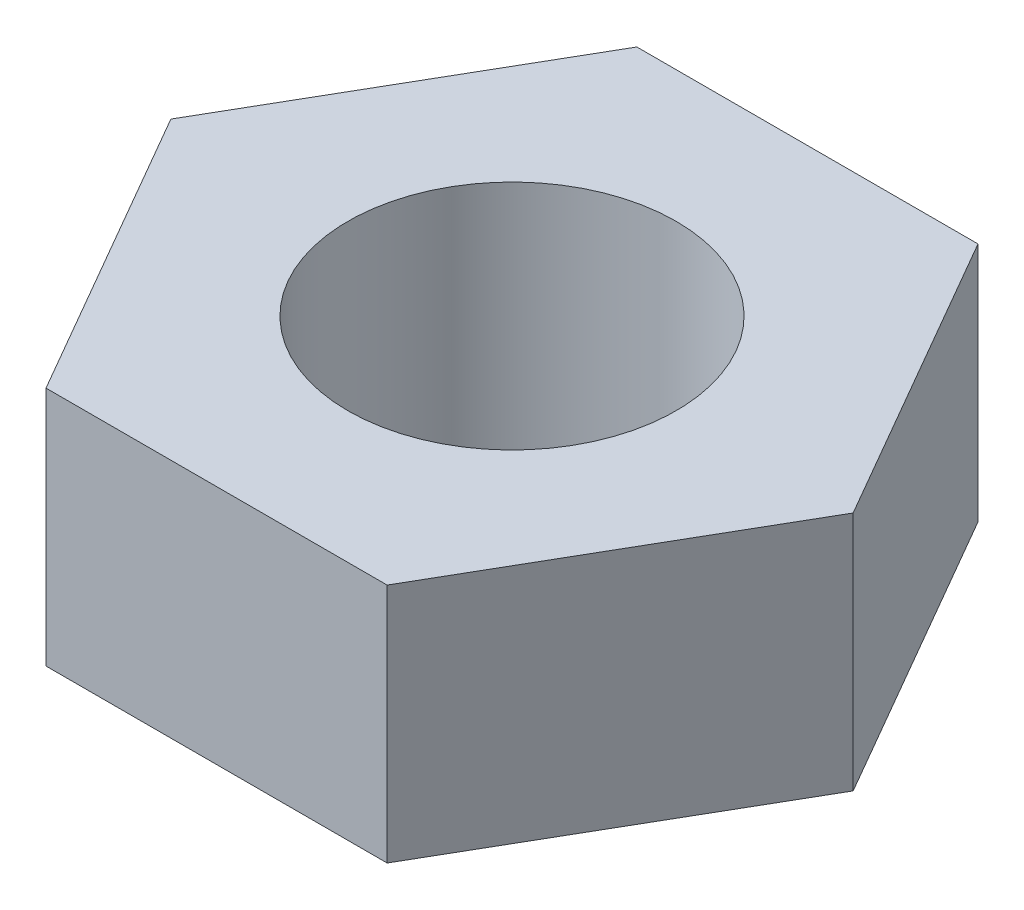
ISO-10303-21;
HEADER;
FILE_DESCRIPTION(('STEP AP214'),'2;1');
FILE_NAME('part.step','',(''),(''),'','','');
FILE_SCHEMA(('AUTOMOTIVE_DESIGN { 1 0 10303 214 1 1 1 1 }'));
ENDSEC;
DATA;
#1=APPLICATION_CONTEXT('core data for automotive mechanical design processes');
#2=APPLICATION_PROTOCOL_DEFINITION('international standard','automotive_design',2000,#1);
#3=PRODUCT_CONTEXT('',#1,'mechanical');
#4=PRODUCT('Part','Part','',(#3));
#5=PRODUCT_RELATED_PRODUCT_CATEGORY('part','',(#4));
#6=PRODUCT_DEFINITION_FORMATION('','',#4);
#7=PRODUCT_DEFINITION_CONTEXT('part definition',#1,'design');
#8=PRODUCT_DEFINITION('design','',#6,#7);
#9=PRODUCT_DEFINITION_SHAPE('','',#8);
#10=(LENGTH_UNIT() NAMED_UNIT(*) SI_UNIT(.MILLI.,.METRE.));
#11=(NAMED_UNIT(*) PLANE_ANGLE_UNIT() SI_UNIT($,.RADIAN.));
#12=(NAMED_UNIT(*) SI_UNIT($,.STERADIAN.) SOLID_ANGLE_UNIT());
#13=UNCERTAINTY_MEASURE_WITH_UNIT(LENGTH_MEASURE(1.E-05),#10,'distance_accuracy_value','');
#14=(GEOMETRIC_REPRESENTATION_CONTEXT(3) GLOBAL_UNCERTAINTY_ASSIGNED_CONTEXT((#13)) GLOBAL_UNIT_ASSIGNED_CONTEXT((#10,
#11,#12)) REPRESENTATION_CONTEXT('',''));
#15=CARTESIAN_POINT('',(0.,0.,0.));
#16=DIRECTION('',(0.,0.,1.));
#17=DIRECTION('',(1.,0.,0.));
#18=AXIS2_PLACEMENT_3D('',#15,#16,#17);
#19=CARTESIAN_POINT('',(0.,2.2,0.));
#20=DIRECTION('',(0.,1.,0.));
#21=DIRECTION('',(0.,0.,1.));
#22=AXIS2_PLACEMENT_3D('',#19,#20,#21);
#23=PLANE('',#22);
#24=DIRECTION('',(0.499999999999995,0.,-0.866025403784442));
#25=VECTOR('',#24,1.);
#26=CARTESIAN_POINT('',(1.55884572681202,2.2,2.69999999999998));
#27=LINE('',#26,#25);
#28=CARTESIAN_POINT('',(1.55884572681202,2.2,2.69999999999998));
#29=VERTEX_POINT('',#28);
#30=CARTESIAN_POINT('',(3.11769145362398,2.2,0.));
#31=VERTEX_POINT('',#30);
#32=EDGE_CURVE('E129',#29,#31,#27,.T.);
#33=ORIENTED_EDGE('',*,*,#32,.T.);
#34=DIRECTION('',(-0.500000000000001,0.,-0.866025403784438));
#35=VECTOR('',#34,1.);
#36=CARTESIAN_POINT('',(3.11769145362398,2.2,0.));
#37=LINE('',#36,#35);
#38=CARTESIAN_POINT('',(1.55884572681198,2.2,-2.70000000000001));
#39=VERTEX_POINT('',#38);
#40=EDGE_CURVE('E87',#31,#39,#37,.T.);
#41=ORIENTED_EDGE('',*,*,#40,.T.);
#42=DIRECTION('',(-1.,0.,0.));
#43=VECTOR('',#42,1.);
#44=CARTESIAN_POINT('',(1.55884572681198,2.2,-2.70000000000001));
#45=LINE('',#44,#43);
#46=CARTESIAN_POINT('',(-1.558845726812,2.2,-2.69999999999999));
#47=VERTEX_POINT('',#46);
#48=EDGE_CURVE('E100',#39,#47,#45,.T.);
#49=ORIENTED_EDGE('',*,*,#48,.T.);
#50=DIRECTION('',(-0.499999999999995,0.,0.866025403784441));
#51=VECTOR('',#50,1.);
#52=CARTESIAN_POINT('',(-1.558845726812,2.2,-2.69999999999999));
#53=LINE('',#52,#51);
#54=CARTESIAN_POINT('',(-3.11769145362398,2.2,0.));
#55=VERTEX_POINT('',#54);
#56=EDGE_CURVE('E94',#47,#55,#53,.T.);
#57=ORIENTED_EDGE('',*,*,#56,.T.);
#58=DIRECTION('',(0.500000000000007,0.,0.866025403784435));
#59=VECTOR('',#58,1.);
#60=CARTESIAN_POINT('',(-3.11769145362398,2.2,0.));
#61=LINE('',#60,#59);
#62=CARTESIAN_POINT('',(-1.55884572681197,2.2,2.70000000000002));
#63=VERTEX_POINT('',#62);
#64=EDGE_CURVE('E98',#55,#63,#61,.T.);
#65=ORIENTED_EDGE('',*,*,#64,.T.);
#66=DIRECTION('',(1.,0.,0.));
#67=VECTOR('',#66,1.);
#68=CARTESIAN_POINT('',(-1.55884572681197,2.2,2.70000000000002));
#69=LINE('',#68,#67);
#70=EDGE_CURVE('E50',#63,#29,#69,.T.);
#71=ORIENTED_EDGE('',*,*,#70,.T.);
#72=EDGE_LOOP('',(#33,#41,#49,#57,#65,#71));
#73=FACE_BOUND('',#72,.T.);
#74=CARTESIAN_POINT('',(0.,2.2,0.));
#75=DIRECTION('',(0.,1.,0.));
#76=DIRECTION('',(0.,0.,1.));
#77=AXIS2_PLACEMENT_3D('',#74,#75,#76);
#78=CIRCLE('',#77,1.5);
#79=CARTESIAN_POINT('',(0.,2.2,1.5));
#80=VERTEX_POINT('',#79);
#81=EDGE_CURVE('E122',#80,#80,#78,.T.);
#82=ORIENTED_EDGE('',*,*,#81,.F.);
#83=EDGE_LOOP('',(#82));
#84=FACE_BOUND('',#83,.T.);
#85=ADVANCED_FACE('F33',(#73,#84),#23,.T.);
#86=CARTESIAN_POINT('',(0.,0.,0.));
#87=DIRECTION('',(0.,1.,0.));
#88=DIRECTION('',(0.,0.,1.));
#89=AXIS2_PLACEMENT_3D('',#86,#87,#88);
#90=PLANE('',#89);
#91=DIRECTION('',(0.499999999999995,0.,-0.866025403784442));
#92=VECTOR('',#91,1.);
#93=CARTESIAN_POINT('',(1.55884572681202,0.,2.69999999999998));
#94=LINE('',#93,#92);
#95=CARTESIAN_POINT('',(1.55884572681202,0.,2.69999999999998));
#96=VERTEX_POINT('',#95);
#97=CARTESIAN_POINT('',(3.11769145362398,0.,0.));
#98=VERTEX_POINT('',#97);
#99=EDGE_CURVE('E118',#96,#98,#94,.T.);
#100=ORIENTED_EDGE('',*,*,#99,.F.);
#101=DIRECTION('',(1.,0.,0.));
#102=VECTOR('',#101,1.);
#103=CARTESIAN_POINT('',(-1.55884572681197,0.,2.70000000000002));
#104=LINE('',#103,#102);
#105=CARTESIAN_POINT('',(-1.55884572681197,0.,2.70000000000002));
#106=VERTEX_POINT('',#105);
#107=EDGE_CURVE('E79',#106,#96,#104,.T.);
#108=ORIENTED_EDGE('',*,*,#107,.F.);
#109=DIRECTION('',(0.500000000000007,0.,0.866025403784435));
#110=VECTOR('',#109,1.);
#111=CARTESIAN_POINT('',(-3.11769145362398,0.,0.));
#112=LINE('',#111,#110);
#113=CARTESIAN_POINT('',(-3.11769145362398,0.,0.));
#114=VERTEX_POINT('',#113);
#115=EDGE_CURVE('E73',#114,#106,#112,.T.);
#116=ORIENTED_EDGE('',*,*,#115,.F.);
#117=DIRECTION('',(-0.499999999999995,0.,0.866025403784441));
#118=VECTOR('',#117,1.);
#119=CARTESIAN_POINT('',(-1.558845726812,0.,-2.69999999999999));
#120=LINE('',#119,#118);
#121=CARTESIAN_POINT('',(-1.558845726812,0.,-2.69999999999999));
#122=VERTEX_POINT('',#121);
#123=EDGE_CURVE('E108',#122,#114,#120,.T.);
#124=ORIENTED_EDGE('',*,*,#123,.F.);
#125=DIRECTION('',(-1.,0.,0.));
#126=VECTOR('',#125,1.);
#127=CARTESIAN_POINT('',(1.55884572681198,0.,-2.70000000000001));
#128=LINE('',#127,#126);
#129=CARTESIAN_POINT('',(1.55884572681198,0.,-2.70000000000001));
#130=VERTEX_POINT('',#129);
#131=EDGE_CURVE('E124',#130,#122,#128,.T.);
#132=ORIENTED_EDGE('',*,*,#131,.F.);
#133=DIRECTION('',(-0.500000000000001,0.,-0.866025403784438));
#134=VECTOR('',#133,1.);
#135=CARTESIAN_POINT('',(3.11769145362398,0.,0.));
#136=LINE('',#135,#134);
#137=EDGE_CURVE('E121',#98,#130,#136,.T.);
#138=ORIENTED_EDGE('',*,*,#137,.F.);
#139=EDGE_LOOP('',(#100,#108,#116,#124,#132,#138));
#140=FACE_BOUND('',#139,.T.);
#141=CARTESIAN_POINT('',(0.,0.,0.));
#142=DIRECTION('',(0.,1.,0.));
#143=DIRECTION('',(0.,0.,1.));
#144=AXIS2_PLACEMENT_3D('',#141,#142,#143);
#145=CIRCLE('',#144,1.5);
#146=CARTESIAN_POINT('',(0.,0.,1.5));
#147=VERTEX_POINT('',#146);
#148=EDGE_CURVE('E222',#147,#147,#145,.T.);
#149=ORIENTED_EDGE('',*,*,#148,.T.);
#150=EDGE_LOOP('',(#149));
#151=FACE_BOUND('',#150,.T.);
#152=ADVANCED_FACE('F138',(#140,#151),#90,.F.);
#153=CARTESIAN_POINT('',(1.55884572681202,2.2,2.69999999999998));
#154=DIRECTION('',(-0.866025403784442,0.,-0.499999999999995));
#155=DIRECTION('',(-0.499999999999995,0.,0.866025403784442));
#156=AXIS2_PLACEMENT_3D('',#153,#154,#155);
#157=PLANE('',#156);
#158=ORIENTED_EDGE('',*,*,#99,.T.);
#159=DIRECTION('',(0.,-1.,0.));
#160=VECTOR('',#159,1.);
#161=CARTESIAN_POINT('',(3.11769145362398,2.2,0.));
#162=LINE('',#161,#160);
#163=EDGE_CURVE('E11',#31,#98,#162,.T.);
#164=ORIENTED_EDGE('',*,*,#163,.F.);
#165=ORIENTED_EDGE('',*,*,#32,.F.);
#166=DIRECTION('',(0.,-1.,0.));
#167=VECTOR('',#166,1.);
#168=CARTESIAN_POINT('',(1.55884572681202,2.2,2.69999999999998));
#169=LINE('',#168,#167);
#170=EDGE_CURVE('E114',#29,#96,#169,.T.);
#171=ORIENTED_EDGE('',*,*,#170,.T.);
#172=EDGE_LOOP('',(#158,#164,#165,#171));
#173=FACE_BOUND('',#172,.T.);
#174=ADVANCED_FACE('F35',(#173),#157,.F.);
#175=CARTESIAN_POINT('',(3.11769145362398,2.2,0.));
#176=DIRECTION('',(-0.866025403784438,0.,0.500000000000001));
#177=DIRECTION('',(0.500000000000001,0.,0.866025403784438));
#178=AXIS2_PLACEMENT_3D('',#175,#176,#177);
#179=PLANE('',#178);
#180=ORIENTED_EDGE('',*,*,#137,.T.);
#181=DIRECTION('',(0.,-1.,0.));
#182=VECTOR('',#181,1.);
#183=CARTESIAN_POINT('',(1.55884572681198,2.2,-2.70000000000001));
#184=LINE('',#183,#182);
#185=EDGE_CURVE('E42',#39,#130,#184,.T.);
#186=ORIENTED_EDGE('',*,*,#185,.F.);
#187=ORIENTED_EDGE('',*,*,#40,.F.);
#188=ORIENTED_EDGE('',*,*,#163,.T.);
#189=EDGE_LOOP('',(#180,#186,#187,#188));
#190=FACE_BOUND('',#189,.T.);
#191=ADVANCED_FACE('F163',(#190),#179,.F.);
#192=CARTESIAN_POINT('',(1.55884572681198,2.2,-2.70000000000001));
#193=DIRECTION('',(0.,0.,1.));
#194=DIRECTION('',(1.,0.,0.));
#195=AXIS2_PLACEMENT_3D('',#192,#193,#194);
#196=PLANE('',#195);
#197=ORIENTED_EDGE('',*,*,#131,.T.);
#198=DIRECTION('',(0.,-1.,0.));
#199=VECTOR('',#198,1.);
#200=CARTESIAN_POINT('',(-1.558845726812,2.2,-2.69999999999999));
#201=LINE('',#200,#199);
#202=EDGE_CURVE('E109',#47,#122,#201,.T.);
#203=ORIENTED_EDGE('',*,*,#202,.F.);
#204=ORIENTED_EDGE('',*,*,#48,.F.);
#205=ORIENTED_EDGE('',*,*,#185,.T.);
#206=EDGE_LOOP('',(#197,#203,#204,#205));
#207=FACE_BOUND('',#206,.T.);
#208=ADVANCED_FACE('F135',(#207),#196,.F.);
#209=CARTESIAN_POINT('',(-1.558845726812,2.2,-2.69999999999999));
#210=DIRECTION('',(0.866025403784441,0.,0.499999999999995));
#211=DIRECTION('',(0.499999999999995,0.,-0.866025403784441));
#212=AXIS2_PLACEMENT_3D('',#209,#210,#211);
#213=PLANE('',#212);
#214=ORIENTED_EDGE('',*,*,#123,.T.);
#215=DIRECTION('',(0.,-1.,0.));
#216=VECTOR('',#215,1.);
#217=CARTESIAN_POINT('',(-3.11769145362398,2.2,0.));
#218=LINE('',#217,#216);
#219=EDGE_CURVE('E105',#55,#114,#218,.T.);
#220=ORIENTED_EDGE('',*,*,#219,.F.);
#221=ORIENTED_EDGE('',*,*,#56,.F.);
#222=ORIENTED_EDGE('',*,*,#202,.T.);
#223=EDGE_LOOP('',(#214,#220,#221,#222));
#224=FACE_BOUND('',#223,.T.);
#225=ADVANCED_FACE('F106',(#224),#213,.F.);
#226=CARTESIAN_POINT('',(-3.11769145362398,2.2,0.));
#227=DIRECTION('',(0.866025403784435,0.,-0.500000000000007));
#228=DIRECTION('',(-0.500000000000007,0.,-0.866025403784435));
#229=AXIS2_PLACEMENT_3D('',#226,#227,#228);
#230=PLANE('',#229);
#231=ORIENTED_EDGE('',*,*,#115,.T.);
#232=DIRECTION('',(0.,-1.,0.));
#233=VECTOR('',#232,1.);
#234=CARTESIAN_POINT('',(-1.55884572681197,2.2,2.70000000000002));
#235=LINE('',#234,#233);
#236=EDGE_CURVE('E110',#63,#106,#235,.T.);
#237=ORIENTED_EDGE('',*,*,#236,.F.);
#238=ORIENTED_EDGE('',*,*,#64,.F.);
#239=ORIENTED_EDGE('',*,*,#219,.T.);
#240=EDGE_LOOP('',(#231,#237,#238,#239));
#241=FACE_BOUND('',#240,.T.);
#242=ADVANCED_FACE('F112',(#241),#230,.F.);
#243=CARTESIAN_POINT('',(-1.55884572681197,2.2,2.70000000000002));
#244=DIRECTION('',(0.,0.,-1.));
#245=DIRECTION('',(-1.,0.,0.));
#246=AXIS2_PLACEMENT_3D('',#243,#244,#245);
#247=PLANE('',#246);
#248=ORIENTED_EDGE('',*,*,#107,.T.);
#249=ORIENTED_EDGE('',*,*,#170,.F.);
#250=ORIENTED_EDGE('',*,*,#70,.F.);
#251=ORIENTED_EDGE('',*,*,#236,.T.);
#252=EDGE_LOOP('',(#248,#249,#250,#251));
#253=FACE_BOUND('',#252,.T.);
#254=ADVANCED_FACE('F143',(#253),#247,.F.);
#255=CARTESIAN_POINT('',(0.,2.2,0.));
#256=DIRECTION('',(0.,-1.,0.));
#257=DIRECTION('',(0.,0.,-1.));
#258=AXIS2_PLACEMENT_3D('',#255,#256,#257);
#259=CYLINDRICAL_SURFACE('',#258,1.5);
#260=ORIENTED_EDGE('',*,*,#81,.T.);
#261=EDGE_LOOP('',(#260));
#262=FACE_BOUND('',#261,.T.);
#263=ORIENTED_EDGE('',*,*,#148,.F.);
#264=EDGE_LOOP('',(#263));
#265=FACE_BOUND('',#264,.T.);
#266=ADVANCED_FACE('F145',(#262,#265),#259,.F.);
#267=CLOSED_SHELL('',(#85,#152,#174,#191,#208,#225,#242,#254,#266));
#268=MANIFOLD_SOLID_BREP('B2',#267);
#269=ADVANCED_BREP_SHAPE_REPRESENTATION('',(#18,#268),#14);
#270=SHAPE_DEFINITION_REPRESENTATION(#9,#269);
ENDSEC;
END-ISO-10303-21;
